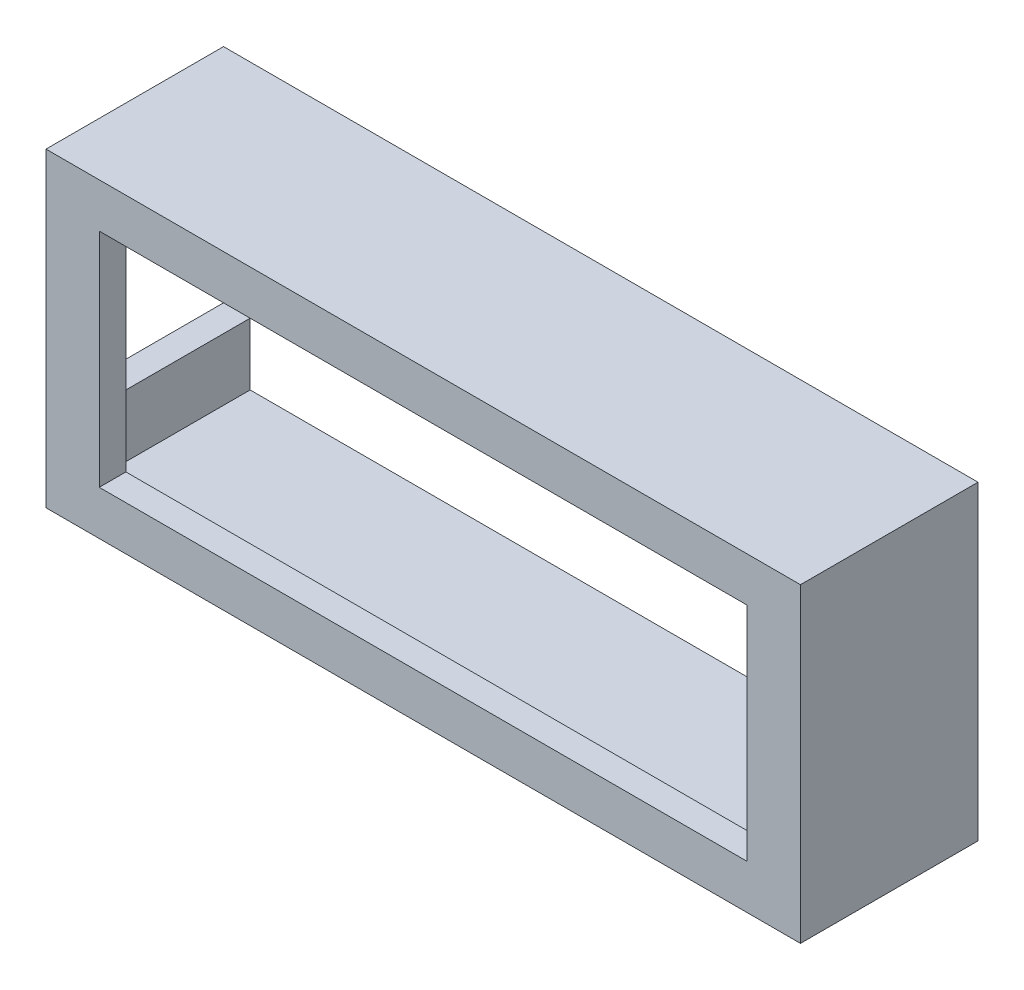
ISO-10303-21;
HEADER;
FILE_DESCRIPTION(('STEP AP214'),'2;1');
FILE_NAME('part.step','',(''),(''),'','','');
FILE_SCHEMA(('AUTOMOTIVE_DESIGN { 1 0 10303 214 1 1 1 1 }'));
ENDSEC;
DATA;
#1=APPLICATION_CONTEXT('core data for automotive mechanical design processes');
#2=APPLICATION_PROTOCOL_DEFINITION('international standard','automotive_design',2000,#1);
#3=PRODUCT_CONTEXT('',#1,'mechanical');
#4=PRODUCT('Part','Part','',(#3));
#5=PRODUCT_RELATED_PRODUCT_CATEGORY('part','',(#4));
#6=PRODUCT_DEFINITION_FORMATION('','',#4);
#7=PRODUCT_DEFINITION_CONTEXT('part definition',#1,'design');
#8=PRODUCT_DEFINITION('design','',#6,#7);
#9=PRODUCT_DEFINITION_SHAPE('','',#8);
#10=(LENGTH_UNIT() NAMED_UNIT(*) SI_UNIT(.MILLI.,.METRE.));
#11=(NAMED_UNIT(*) PLANE_ANGLE_UNIT() SI_UNIT($,.RADIAN.));
#12=(NAMED_UNIT(*) SI_UNIT($,.STERADIAN.) SOLID_ANGLE_UNIT());
#13=UNCERTAINTY_MEASURE_WITH_UNIT(LENGTH_MEASURE(1.E-05),#10,'distance_accuracy_value','');
#14=(GEOMETRIC_REPRESENTATION_CONTEXT(3) GLOBAL_UNCERTAINTY_ASSIGNED_CONTEXT((#13)) GLOBAL_UNIT_ASSIGNED_CONTEXT((#10,
#11,#12)) REPRESENTATION_CONTEXT('',''));
#15=CARTESIAN_POINT('',(0.,0.,0.));
#16=DIRECTION('',(0.,0.,1.));
#17=DIRECTION('',(1.,0.,0.));
#18=AXIS2_PLACEMENT_3D('',#15,#16,#17);
#19=CARTESIAN_POINT('',(-39.5,17.5,20.));
#20=DIRECTION('',(1.,0.,0.));
#21=DIRECTION('',(0.,0.,-1.));
#22=AXIS2_PLACEMENT_3D('',#19,#20,#21);
#23=PLANE('',#22);
#24=DIRECTION('',(0.,0.,1.));
#25=VECTOR('',#24,1.);
#26=CARTESIAN_POINT('',(-39.5,7.5,20.));
#27=LINE('',#26,#25);
#28=CARTESIAN_POINT('',(-39.5,7.5,0.));
#29=VERTEX_POINT('',#28);
#30=CARTESIAN_POINT('',(-39.5,7.5,17.));
#31=VERTEX_POINT('',#30);
#32=EDGE_CURVE('E221',#29,#31,#27,.T.);
#33=ORIENTED_EDGE('',*,*,#32,.F.);
#34=DIRECTION('',(0.,-1.,0.));
#35=VECTOR('',#34,1.);
#36=CARTESIAN_POINT('',(-39.5,17.5,0.));
#37=LINE('',#36,#35);
#38=CARTESIAN_POINT('',(-39.5,14.5,0.));
#39=VERTEX_POINT('',#38);
#40=EDGE_CURVE('E264',#39,#29,#37,.T.);
#41=ORIENTED_EDGE('',*,*,#40,.F.);
#42=DIRECTION('',(0.,0.,-1.));
#43=VECTOR('',#42,1.);
#44=CARTESIAN_POINT('',(-39.5,14.5,20.));
#45=LINE('',#44,#43);
#46=CARTESIAN_POINT('',(-39.5,14.5,17.));
#47=VERTEX_POINT('',#46);
#48=EDGE_CURVE('E230',#47,#39,#45,.T.);
#49=ORIENTED_EDGE('',*,*,#48,.F.);
#50=DIRECTION('',(0.,-1.,0.));
#51=VECTOR('',#50,1.);
#52=CARTESIAN_POINT('',(-39.5,17.5,17.));
#53=LINE('',#52,#51);
#54=EDGE_CURVE('E251',#47,#31,#53,.T.);
#55=ORIENTED_EDGE('',*,*,#54,.T.);
#56=EDGE_LOOP('',(#33,#41,#49,#55));
#57=FACE_BOUND('',#56,.T.);
#58=ADVANCED_FACE('F45',(#57),#23,.T.);
#59=CARTESIAN_POINT('',(42.5,17.5,20.));
#60=DIRECTION('',(-1.,0.,0.));
#61=DIRECTION('',(0.,0.,1.));
#62=AXIS2_PLACEMENT_3D('',#59,#60,#61);
#63=PLANE('',#62);
#64=DIRECTION('',(0.,1.,0.));
#65=VECTOR('',#64,1.);
#66=CARTESIAN_POINT('',(42.5,17.5,0.));
#67=LINE('',#66,#65);
#68=CARTESIAN_POINT('',(42.5,-17.5,0.));
#69=VERTEX_POINT('',#68);
#70=CARTESIAN_POINT('',(42.5,17.5,0.));
#71=VERTEX_POINT('',#70);
#72=EDGE_CURVE('E229',#69,#71,#67,.T.);
#73=ORIENTED_EDGE('',*,*,#72,.T.);
#74=DIRECTION('',(0.,0.,-1.));
#75=VECTOR('',#74,1.);
#76=CARTESIAN_POINT('',(42.5,17.5,20.));
#77=LINE('',#76,#75);
#78=CARTESIAN_POINT('',(42.5,17.5,20.));
#79=VERTEX_POINT('',#78);
#80=EDGE_CURVE('E311',#79,#71,#77,.T.);
#81=ORIENTED_EDGE('',*,*,#80,.F.);
#82=DIRECTION('',(0.,1.,0.));
#83=VECTOR('',#82,1.);
#84=CARTESIAN_POINT('',(42.5,17.5,20.));
#85=LINE('',#84,#83);
#86=CARTESIAN_POINT('',(42.5,-17.5,20.));
#87=VERTEX_POINT('',#86);
#88=EDGE_CURVE('E272',#87,#79,#85,.T.);
#89=ORIENTED_EDGE('',*,*,#88,.F.);
#90=DIRECTION('',(0.,0.,-1.));
#91=VECTOR('',#90,1.);
#92=CARTESIAN_POINT('',(42.5,-17.5,20.));
#93=LINE('',#92,#91);
#94=EDGE_CURVE('E286',#87,#69,#93,.T.);
#95=ORIENTED_EDGE('',*,*,#94,.T.);
#96=EDGE_LOOP('',(#73,#81,#89,#95));
#97=FACE_BOUND('',#96,.T.);
#98=ADVANCED_FACE('F47',(#97),#63,.F.);
#99=CARTESIAN_POINT('',(-42.5,17.5,20.));
#100=DIRECTION('',(0.,-1.,0.));
#101=DIRECTION('',(0.,0.,-1.));
#102=AXIS2_PLACEMENT_3D('',#99,#100,#101);
#103=PLANE('',#102);
#104=DIRECTION('',(-1.,0.,0.));
#105=VECTOR('',#104,1.);
#106=CARTESIAN_POINT('',(-42.5,17.5,0.));
#107=LINE('',#106,#105);
#108=CARTESIAN_POINT('',(-42.5,17.5,0.));
#109=VERTEX_POINT('',#108);
#110=EDGE_CURVE('E290',#71,#109,#107,.T.);
#111=ORIENTED_EDGE('',*,*,#110,.T.);
#112=DIRECTION('',(0.,0.,-1.));
#113=VECTOR('',#112,1.);
#114=CARTESIAN_POINT('',(-42.5,17.5,20.));
#115=LINE('',#114,#113);
#116=CARTESIAN_POINT('',(-42.5,17.5,20.));
#117=VERTEX_POINT('',#116);
#118=EDGE_CURVE('E307',#117,#109,#115,.T.);
#119=ORIENTED_EDGE('',*,*,#118,.F.);
#120=DIRECTION('',(-1.,0.,0.));
#121=VECTOR('',#120,1.);
#122=CARTESIAN_POINT('',(-42.5,17.5,20.));
#123=LINE('',#122,#121);
#124=EDGE_CURVE('E276',#79,#117,#123,.T.);
#125=ORIENTED_EDGE('',*,*,#124,.F.);
#126=ORIENTED_EDGE('',*,*,#80,.T.);
#127=EDGE_LOOP('',(#111,#119,#125,#126));
#128=FACE_BOUND('',#127,.T.);
#129=ADVANCED_FACE('F351',(#128),#103,.F.);
#130=CARTESIAN_POINT('',(-42.5,17.5,20.));
#131=DIRECTION('',(1.,0.,0.));
#132=DIRECTION('',(0.,0.,-1.));
#133=AXIS2_PLACEMENT_3D('',#130,#131,#132);
#134=PLANE('',#133);
#135=DIRECTION('',(0.,-1.,0.));
#136=VECTOR('',#135,1.);
#137=CARTESIAN_POINT('',(-42.5,17.5,0.));
#138=LINE('',#137,#136);
#139=CARTESIAN_POINT('',(-42.5,7.5,0.));
#140=VERTEX_POINT('',#139);
#141=EDGE_CURVE('E294',#109,#140,#138,.T.);
#142=ORIENTED_EDGE('',*,*,#141,.T.);
#143=DIRECTION('',(0.,0.,-1.));
#144=VECTOR('',#143,1.);
#145=CARTESIAN_POINT('',(-42.5,7.5,0.));
#146=LINE('',#145,#144);
#147=CARTESIAN_POINT('',(-42.5,7.5,17.));
#148=VERTEX_POINT('',#147);
#149=EDGE_CURVE('E202',#148,#140,#146,.T.);
#150=ORIENTED_EDGE('',*,*,#149,.F.);
#151=DIRECTION('',(0.,1.,0.));
#152=VECTOR('',#151,1.);
#153=CARTESIAN_POINT('',(-42.5,7.5,17.));
#154=LINE('',#153,#152);
#155=CARTESIAN_POINT('',(-42.5,-7.5,17.));
#156=VERTEX_POINT('',#155);
#157=EDGE_CURVE('E198',#156,#148,#154,.T.);
#158=ORIENTED_EDGE('',*,*,#157,.F.);
#159=DIRECTION('',(0.,0.,1.));
#160=VECTOR('',#159,1.);
#161=CARTESIAN_POINT('',(-42.5,-7.5,0.));
#162=LINE('',#161,#160);
#163=CARTESIAN_POINT('',(-42.5,-7.5,0.));
#164=VERTEX_POINT('',#163);
#165=EDGE_CURVE('E190',#164,#156,#162,.T.);
#166=ORIENTED_EDGE('',*,*,#165,.F.);
#167=CARTESIAN_POINT('',(-42.5,-17.5,0.));
#168=VERTEX_POINT('',#167);
#169=EDGE_CURVE('E293',#164,#168,#138,.T.);
#170=ORIENTED_EDGE('',*,*,#169,.T.);
#171=DIRECTION('',(0.,0.,-1.));
#172=VECTOR('',#171,1.);
#173=CARTESIAN_POINT('',(-42.5,-17.5,20.));
#174=LINE('',#173,#172);
#175=CARTESIAN_POINT('',(-42.5,-17.5,20.));
#176=VERTEX_POINT('',#175);
#177=EDGE_CURVE('E303',#176,#168,#174,.T.);
#178=ORIENTED_EDGE('',*,*,#177,.F.);
#179=DIRECTION('',(0.,-1.,0.));
#180=VECTOR('',#179,1.);
#181=CARTESIAN_POINT('',(-42.5,17.5,20.));
#182=LINE('',#181,#180);
#183=EDGE_CURVE('E280',#117,#176,#182,.T.);
#184=ORIENTED_EDGE('',*,*,#183,.F.);
#185=ORIENTED_EDGE('',*,*,#118,.T.);
#186=EDGE_LOOP('',(#142,#150,#158,#166,#170,#178,#184,#185));
#187=FACE_BOUND('',#186,.T.);
#188=ADVANCED_FACE('F393',(#187),#134,.F.);
#189=CARTESIAN_POINT('',(-42.5,-17.5,20.));
#190=DIRECTION('',(0.,1.,0.));
#191=DIRECTION('',(0.,0.,1.));
#192=AXIS2_PLACEMENT_3D('',#189,#190,#191);
#193=PLANE('',#192);
#194=DIRECTION('',(1.,0.,0.));
#195=VECTOR('',#194,1.);
#196=CARTESIAN_POINT('',(-42.5,-17.5,0.));
#197=LINE('',#196,#195);
#198=EDGE_CURVE('E277',#168,#69,#197,.T.);
#199=ORIENTED_EDGE('',*,*,#198,.T.);
#200=ORIENTED_EDGE('',*,*,#94,.F.);
#201=DIRECTION('',(1.,0.,0.));
#202=VECTOR('',#201,1.);
#203=CARTESIAN_POINT('',(-42.5,-17.5,20.));
#204=LINE('',#203,#202);
#205=EDGE_CURVE('E283',#176,#87,#204,.T.);
#206=ORIENTED_EDGE('',*,*,#205,.F.);
#207=ORIENTED_EDGE('',*,*,#177,.T.);
#208=EDGE_LOOP('',(#199,#200,#206,#207));
#209=FACE_BOUND('',#208,.T.);
#210=ADVANCED_FACE('F405',(#209),#193,.F.);
#211=CARTESIAN_POINT('',(0.,0.,20.));
#212=DIRECTION('',(0.,0.,1.));
#213=DIRECTION('',(1.,0.,0.));
#214=AXIS2_PLACEMENT_3D('',#211,#212,#213);
#215=PLANE('',#214);
#216=DIRECTION('',(0.,1.,0.));
#217=VECTOR('',#216,1.);
#218=CARTESIAN_POINT('',(36.5,12.5,20.));
#219=LINE('',#218,#217);
#220=CARTESIAN_POINT('',(36.5,-12.5,20.));
#221=VERTEX_POINT('',#220);
#222=CARTESIAN_POINT('',(36.5,12.5,20.));
#223=VERTEX_POINT('',#222);
#224=EDGE_CURVE('E61',#221,#223,#219,.T.);
#225=ORIENTED_EDGE('',*,*,#224,.F.);
#226=DIRECTION('',(1.,0.,0.));
#227=VECTOR('',#226,1.);
#228=CARTESIAN_POINT('',(-36.5,-12.5,20.));
#229=LINE('',#228,#227);
#230=CARTESIAN_POINT('',(-36.5,-12.5,20.));
#231=VERTEX_POINT('',#230);
#232=EDGE_CURVE('E180',#231,#221,#229,.T.);
#233=ORIENTED_EDGE('',*,*,#232,.F.);
#234=DIRECTION('',(0.,-1.,0.));
#235=VECTOR('',#234,1.);
#236=CARTESIAN_POINT('',(-36.5,12.5,20.));
#237=LINE('',#236,#235);
#238=CARTESIAN_POINT('',(-36.5,12.5,20.));
#239=VERTEX_POINT('',#238);
#240=EDGE_CURVE('E162',#239,#231,#237,.T.);
#241=ORIENTED_EDGE('',*,*,#240,.F.);
#242=DIRECTION('',(-1.,0.,0.));
#243=VECTOR('',#242,1.);
#244=CARTESIAN_POINT('',(-36.5,12.5,20.));
#245=LINE('',#244,#243);
#246=EDGE_CURVE('E172',#223,#239,#245,.T.);
#247=ORIENTED_EDGE('',*,*,#246,.F.);
#248=EDGE_LOOP('',(#225,#233,#241,#247));
#249=FACE_BOUND('',#248,.T.);
#250=ORIENTED_EDGE('',*,*,#88,.T.);
#251=ORIENTED_EDGE('',*,*,#124,.T.);
#252=ORIENTED_EDGE('',*,*,#183,.T.);
#253=ORIENTED_EDGE('',*,*,#205,.T.);
#254=EDGE_LOOP('',(#250,#251,#252,#253));
#255=FACE_BOUND('',#254,.T.);
#256=ADVANCED_FACE('F177',(#249,#255),#215,.T.);
#257=CARTESIAN_POINT('',(0.,0.,0.));
#258=DIRECTION('',(0.,0.,1.));
#259=DIRECTION('',(1.,0.,0.));
#260=AXIS2_PLACEMENT_3D('',#257,#258,#259);
#261=PLANE('',#260);
#262=ORIENTED_EDGE('',*,*,#40,.T.);
#263=DIRECTION('',(-1.,0.,0.));
#264=VECTOR('',#263,1.);
#265=CARTESIAN_POINT('',(-22.5,7.5,0.));
#266=LINE('',#265,#264);
#267=EDGE_CURVE('E206',#29,#140,#266,.T.);
#268=ORIENTED_EDGE('',*,*,#267,.T.);
#269=ORIENTED_EDGE('',*,*,#141,.F.);
#270=ORIENTED_EDGE('',*,*,#110,.F.);
#271=ORIENTED_EDGE('',*,*,#72,.F.);
#272=ORIENTED_EDGE('',*,*,#198,.F.);
#273=ORIENTED_EDGE('',*,*,#169,.F.);
#274=DIRECTION('',(-1.,0.,0.));
#275=VECTOR('',#274,1.);
#276=CARTESIAN_POINT('',(-22.5,-7.5,0.));
#277=LINE('',#276,#275);
#278=CARTESIAN_POINT('',(-39.5,-7.5,0.));
#279=VERTEX_POINT('',#278);
#280=EDGE_CURVE('E205',#279,#164,#277,.T.);
#281=ORIENTED_EDGE('',*,*,#280,.F.);
#282=CARTESIAN_POINT('',(-39.5,-14.5,0.));
#283=VERTEX_POINT('',#282);
#284=EDGE_CURVE('E268',#279,#283,#37,.T.);
#285=ORIENTED_EDGE('',*,*,#284,.T.);
#286=DIRECTION('',(1.,0.,0.));
#287=VECTOR('',#286,1.);
#288=CARTESIAN_POINT('',(-42.5,-14.5,0.));
#289=LINE('',#288,#287);
#290=CARTESIAN_POINT('',(39.5,-14.5,0.));
#291=VERTEX_POINT('',#290);
#292=EDGE_CURVE('E236',#283,#291,#289,.T.);
#293=ORIENTED_EDGE('',*,*,#292,.T.);
#294=DIRECTION('',(0.,1.,0.));
#295=VECTOR('',#294,1.);
#296=CARTESIAN_POINT('',(39.5,17.5,0.));
#297=LINE('',#296,#295);
#298=CARTESIAN_POINT('',(39.5,14.5,0.));
#299=VERTEX_POINT('',#298);
#300=EDGE_CURVE('E224',#291,#299,#297,.T.);
#301=ORIENTED_EDGE('',*,*,#300,.T.);
#302=DIRECTION('',(-1.,0.,0.));
#303=VECTOR('',#302,1.);
#304=CARTESIAN_POINT('',(-42.5,14.5,0.));
#305=LINE('',#304,#303);
#306=EDGE_CURVE('E260',#299,#39,#305,.T.);
#307=ORIENTED_EDGE('',*,*,#306,.T.);
#308=EDGE_LOOP('',(#262,#268,#269,#270,#271,#272,#273,#281,#285,#293,#301,#307));
#309=FACE_BOUND('',#308,.T.);
#310=ADVANCED_FACE('F378',(#309),#261,.F.);
#311=CARTESIAN_POINT('',(39.5,17.5,20.));
#312=DIRECTION('',(-1.,0.,0.));
#313=DIRECTION('',(0.,0.,1.));
#314=AXIS2_PLACEMENT_3D('',#311,#312,#313);
#315=PLANE('',#314);
#316=ORIENTED_EDGE('',*,*,#300,.F.);
#317=DIRECTION('',(0.,0.,-1.));
#318=VECTOR('',#317,1.);
#319=CARTESIAN_POINT('',(39.5,-14.5,20.));
#320=LINE('',#319,#318);
#321=CARTESIAN_POINT('',(39.5,-14.5,17.));
#322=VERTEX_POINT('',#321);
#323=EDGE_CURVE('E237',#322,#291,#320,.T.);
#324=ORIENTED_EDGE('',*,*,#323,.F.);
#325=DIRECTION('',(0.,1.,0.));
#326=VECTOR('',#325,1.);
#327=CARTESIAN_POINT('',(39.5,17.5,17.));
#328=LINE('',#327,#326);
#329=CARTESIAN_POINT('',(39.5,14.5,17.));
#330=VERTEX_POINT('',#329);
#331=EDGE_CURVE('E231',#322,#330,#328,.T.);
#332=ORIENTED_EDGE('',*,*,#331,.T.);
#333=DIRECTION('',(0.,0.,-1.));
#334=VECTOR('',#333,1.);
#335=CARTESIAN_POINT('',(39.5,14.5,20.));
#336=LINE('',#335,#334);
#337=EDGE_CURVE('E225',#330,#299,#336,.T.);
#338=ORIENTED_EDGE('',*,*,#337,.T.);
#339=EDGE_LOOP('',(#316,#324,#332,#338));
#340=FACE_BOUND('',#339,.T.);
#341=ADVANCED_FACE('F366',(#340),#315,.T.);
#342=CARTESIAN_POINT('',(-42.5,14.5,20.));
#343=DIRECTION('',(0.,-1.,0.));
#344=DIRECTION('',(0.,0.,-1.));
#345=AXIS2_PLACEMENT_3D('',#342,#343,#344);
#346=PLANE('',#345);
#347=ORIENTED_EDGE('',*,*,#306,.F.);
#348=ORIENTED_EDGE('',*,*,#337,.F.);
#349=DIRECTION('',(-1.,0.,0.));
#350=VECTOR('',#349,1.);
#351=CARTESIAN_POINT('',(-42.5,14.5,17.));
#352=LINE('',#351,#350);
#353=EDGE_CURVE('E235',#330,#47,#352,.T.);
#354=ORIENTED_EDGE('',*,*,#353,.T.);
#355=ORIENTED_EDGE('',*,*,#48,.T.);
#356=EDGE_LOOP('',(#347,#348,#354,#355));
#357=FACE_BOUND('',#356,.T.);
#358=ADVANCED_FACE('F358',(#357),#346,.T.);
#359=DIRECTION('',(0.,0.,-1.));
#360=VECTOR('',#359,1.);
#361=CARTESIAN_POINT('',(-39.5,-7.5,20.));
#362=LINE('',#361,#360);
#363=CARTESIAN_POINT('',(-39.5,-7.5,17.));
#364=VERTEX_POINT('',#363);
#365=EDGE_CURVE('E210',#364,#279,#362,.T.);
#366=ORIENTED_EDGE('',*,*,#365,.F.);
#367=CARTESIAN_POINT('',(-39.5,-14.5,17.));
#368=VERTEX_POINT('',#367);
#369=EDGE_CURVE('E247',#364,#368,#53,.T.);
#370=ORIENTED_EDGE('',*,*,#369,.T.);
#371=DIRECTION('',(0.,0.,-1.));
#372=VECTOR('',#371,1.);
#373=CARTESIAN_POINT('',(-39.5,-14.5,20.));
#374=LINE('',#373,#372);
#375=EDGE_CURVE('E240',#368,#283,#374,.T.);
#376=ORIENTED_EDGE('',*,*,#375,.T.);
#377=ORIENTED_EDGE('',*,*,#284,.F.);
#378=EDGE_LOOP('',(#366,#370,#376,#377));
#379=FACE_BOUND('',#378,.T.);
#380=ADVANCED_FACE('F345',(#379),#23,.T.);
#381=CARTESIAN_POINT('',(-42.5,-14.5,20.));
#382=DIRECTION('',(0.,1.,0.));
#383=DIRECTION('',(0.,0.,1.));
#384=AXIS2_PLACEMENT_3D('',#381,#382,#383);
#385=PLANE('',#384);
#386=ORIENTED_EDGE('',*,*,#292,.F.);
#387=ORIENTED_EDGE('',*,*,#375,.F.);
#388=DIRECTION('',(1.,0.,0.));
#389=VECTOR('',#388,1.);
#390=CARTESIAN_POINT('',(-42.5,-14.5,17.));
#391=LINE('',#390,#389);
#392=EDGE_CURVE('E241',#368,#322,#391,.T.);
#393=ORIENTED_EDGE('',*,*,#392,.T.);
#394=ORIENTED_EDGE('',*,*,#323,.T.);
#395=EDGE_LOOP('',(#386,#387,#393,#394));
#396=FACE_BOUND('',#395,.T.);
#397=ADVANCED_FACE('F357',(#396),#385,.T.);
#398=CARTESIAN_POINT('',(0.,0.,17.));
#399=DIRECTION('',(0.,0.,1.));
#400=DIRECTION('',(1.,0.,0.));
#401=AXIS2_PLACEMENT_3D('',#398,#399,#400);
#402=PLANE('',#401);
#403=DIRECTION('',(1.,0.,0.));
#404=VECTOR('',#403,1.);
#405=CARTESIAN_POINT('',(0.,-12.5,17.));
#406=LINE('',#405,#404);
#407=CARTESIAN_POINT('',(-36.5,-12.5,17.));
#408=VERTEX_POINT('',#407);
#409=CARTESIAN_POINT('',(36.5,-12.5,17.));
#410=VERTEX_POINT('',#409);
#411=EDGE_CURVE('E54',#408,#410,#406,.T.);
#412=ORIENTED_EDGE('',*,*,#411,.T.);
#413=DIRECTION('',(0.,1.,0.));
#414=VECTOR('',#413,1.);
#415=CARTESIAN_POINT('',(36.5,0.,17.));
#416=LINE('',#415,#414);
#417=CARTESIAN_POINT('',(36.5,12.5,17.));
#418=VERTEX_POINT('',#417);
#419=EDGE_CURVE('E11',#410,#418,#416,.T.);
#420=ORIENTED_EDGE('',*,*,#419,.T.);
#421=DIRECTION('',(-1.,0.,0.));
#422=VECTOR('',#421,1.);
#423=CARTESIAN_POINT('',(0.,12.5,17.));
#424=LINE('',#423,#422);
#425=CARTESIAN_POINT('',(-36.5,12.5,17.));
#426=VERTEX_POINT('',#425);
#427=EDGE_CURVE('E315',#418,#426,#424,.T.);
#428=ORIENTED_EDGE('',*,*,#427,.T.);
#429=DIRECTION('',(0.,-1.,0.));
#430=VECTOR('',#429,1.);
#431=CARTESIAN_POINT('',(-36.5,0.,17.));
#432=LINE('',#431,#430);
#433=EDGE_CURVE('E165',#426,#408,#432,.T.);
#434=ORIENTED_EDGE('',*,*,#433,.T.);
#435=EDGE_LOOP('',(#412,#420,#428,#434));
#436=FACE_BOUND('',#435,.T.);
#437=ORIENTED_EDGE('',*,*,#369,.F.);
#438=DIRECTION('',(-1.,0.,0.));
#439=VECTOR('',#438,1.);
#440=CARTESIAN_POINT('',(-22.5,-7.5,17.));
#441=LINE('',#440,#439);
#442=EDGE_CURVE('E214',#364,#156,#441,.T.);
#443=ORIENTED_EDGE('',*,*,#442,.T.);
#444=ORIENTED_EDGE('',*,*,#157,.T.);
#445=DIRECTION('',(-1.,0.,0.));
#446=VECTOR('',#445,1.);
#447=CARTESIAN_POINT('',(-22.5,7.5,17.));
#448=LINE('',#447,#446);
#449=EDGE_CURVE('E211',#31,#148,#448,.T.);
#450=ORIENTED_EDGE('',*,*,#449,.F.);
#451=ORIENTED_EDGE('',*,*,#54,.F.);
#452=ORIENTED_EDGE('',*,*,#353,.F.);
#453=ORIENTED_EDGE('',*,*,#331,.F.);
#454=ORIENTED_EDGE('',*,*,#392,.F.);
#455=EDGE_LOOP('',(#437,#443,#444,#450,#451,#452,#453,#454));
#456=FACE_BOUND('',#455,.T.);
#457=ADVANCED_FACE('F322',(#436,#456),#402,.F.);
#458=CARTESIAN_POINT('',(-22.5,7.5,0.));
#459=DIRECTION('',(0.,1.,0.));
#460=DIRECTION('',(0.,0.,1.));
#461=AXIS2_PLACEMENT_3D('',#458,#459,#460);
#462=PLANE('',#461);
#463=ORIENTED_EDGE('',*,*,#32,.T.);
#464=ORIENTED_EDGE('',*,*,#449,.T.);
#465=ORIENTED_EDGE('',*,*,#149,.T.);
#466=ORIENTED_EDGE('',*,*,#267,.F.);
#467=EDGE_LOOP('',(#463,#464,#465,#466));
#468=FACE_BOUND('',#467,.T.);
#469=ADVANCED_FACE('F337',(#468),#462,.F.);
#470=CARTESIAN_POINT('',(-22.5,-7.5,0.));
#471=DIRECTION('',(0.,-1.,0.));
#472=DIRECTION('',(0.,0.,-1.));
#473=AXIS2_PLACEMENT_3D('',#470,#471,#472);
#474=PLANE('',#473);
#475=ORIENTED_EDGE('',*,*,#365,.T.);
#476=ORIENTED_EDGE('',*,*,#280,.T.);
#477=ORIENTED_EDGE('',*,*,#165,.T.);
#478=ORIENTED_EDGE('',*,*,#442,.F.);
#479=EDGE_LOOP('',(#475,#476,#477,#478));
#480=FACE_BOUND('',#479,.T.);
#481=ADVANCED_FACE('F329',(#480),#474,.F.);
#482=CARTESIAN_POINT('',(36.5,12.5,0.));
#483=DIRECTION('',(1.,0.,0.));
#484=DIRECTION('',(0.,0.,-1.));
#485=AXIS2_PLACEMENT_3D('',#482,#483,#484);
#486=PLANE('',#485);
#487=DIRECTION('',(0.,0.,1.));
#488=VECTOR('',#487,1.);
#489=CARTESIAN_POINT('',(36.5,-12.5,0.));
#490=LINE('',#489,#488);
#491=EDGE_CURVE('E187',#410,#221,#490,.T.);
#492=ORIENTED_EDGE('',*,*,#491,.T.);
#493=ORIENTED_EDGE('',*,*,#224,.T.);
#494=DIRECTION('',(0.,0.,1.));
#495=VECTOR('',#494,1.);
#496=CARTESIAN_POINT('',(36.5,12.5,0.));
#497=LINE('',#496,#495);
#498=EDGE_CURVE('E169',#418,#223,#497,.T.);
#499=ORIENTED_EDGE('',*,*,#498,.F.);
#500=ORIENTED_EDGE('',*,*,#419,.F.);
#501=EDGE_LOOP('',(#492,#493,#499,#500));
#502=FACE_BOUND('',#501,.T.);
#503=ADVANCED_FACE('F327',(#502),#486,.F.);
#504=CARTESIAN_POINT('',(-36.5,-12.5,0.));
#505=DIRECTION('',(0.,-1.,0.));
#506=DIRECTION('',(0.,0.,-1.));
#507=AXIS2_PLACEMENT_3D('',#504,#505,#506);
#508=PLANE('',#507);
#509=DIRECTION('',(0.,0.,1.));
#510=VECTOR('',#509,1.);
#511=CARTESIAN_POINT('',(-36.5,-12.5,0.));
#512=LINE('',#511,#510);
#513=EDGE_CURVE('E168',#408,#231,#512,.T.);
#514=ORIENTED_EDGE('',*,*,#513,.T.);
#515=ORIENTED_EDGE('',*,*,#232,.T.);
#516=ORIENTED_EDGE('',*,*,#491,.F.);
#517=ORIENTED_EDGE('',*,*,#411,.F.);
#518=EDGE_LOOP('',(#514,#515,#516,#517));
#519=FACE_BOUND('',#518,.T.);
#520=ADVANCED_FACE('F326',(#519),#508,.F.);
#521=CARTESIAN_POINT('',(-36.5,12.5,0.));
#522=DIRECTION('',(-1.,0.,0.));
#523=DIRECTION('',(0.,0.,1.));
#524=AXIS2_PLACEMENT_3D('',#521,#522,#523);
#525=PLANE('',#524);
#526=DIRECTION('',(0.,0.,1.));
#527=VECTOR('',#526,1.);
#528=CARTESIAN_POINT('',(-36.5,12.5,0.));
#529=LINE('',#528,#527);
#530=EDGE_CURVE('E69',#426,#239,#529,.T.);
#531=ORIENTED_EDGE('',*,*,#530,.T.);
#532=ORIENTED_EDGE('',*,*,#240,.T.);
#533=ORIENTED_EDGE('',*,*,#513,.F.);
#534=ORIENTED_EDGE('',*,*,#433,.F.);
#535=EDGE_LOOP('',(#531,#532,#533,#534));
#536=FACE_BOUND('',#535,.T.);
#537=ADVANCED_FACE('F159',(#536),#525,.F.);
#538=CARTESIAN_POINT('',(-36.5,12.5,0.));
#539=DIRECTION('',(0.,1.,0.));
#540=DIRECTION('',(0.,0.,1.));
#541=AXIS2_PLACEMENT_3D('',#538,#539,#540);
#542=PLANE('',#541);
#543=ORIENTED_EDGE('',*,*,#498,.T.);
#544=ORIENTED_EDGE('',*,*,#246,.T.);
#545=ORIENTED_EDGE('',*,*,#530,.F.);
#546=ORIENTED_EDGE('',*,*,#427,.F.);
#547=EDGE_LOOP('',(#543,#544,#545,#546));
#548=FACE_BOUND('',#547,.T.);
#549=ADVANCED_FACE('F173',(#548),#542,.F.);
#550=CLOSED_SHELL('',(#58,#98,#129,#188,#210,#256,#310,#341,#358,#380,#397,#457,#469,#481,#503,
#520,#537,#549));
#551=MANIFOLD_SOLID_BREP('B2',#550);
#552=ADVANCED_BREP_SHAPE_REPRESENTATION('',(#18,#551),#14);
#553=SHAPE_DEFINITION_REPRESENTATION(#9,#552);
ENDSEC;
END-ISO-10303-21;
